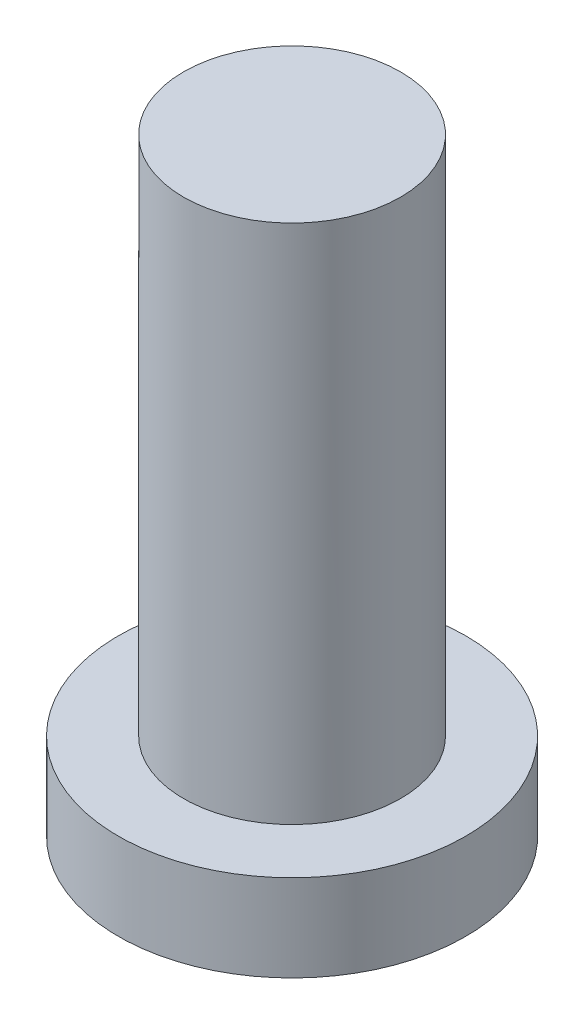
ISO-10303-21;
HEADER;
FILE_DESCRIPTION(('STEP AP214'),'2;1');
FILE_NAME('part.step','',(''),(''),'','','');
FILE_SCHEMA(('AUTOMOTIVE_DESIGN { 1 0 10303 214 1 1 1 1 }'));
ENDSEC;
DATA;
#1=APPLICATION_CONTEXT('core data for automotive mechanical design processes');
#2=APPLICATION_PROTOCOL_DEFINITION('international standard','automotive_design',2000,#1);
#3=PRODUCT_CONTEXT('',#1,'mechanical');
#4=PRODUCT('Part','Part','',(#3));
#5=PRODUCT_RELATED_PRODUCT_CATEGORY('part','',(#4));
#6=PRODUCT_DEFINITION_FORMATION('','',#4);
#7=PRODUCT_DEFINITION_CONTEXT('part definition',#1,'design');
#8=PRODUCT_DEFINITION('design','',#6,#7);
#9=PRODUCT_DEFINITION_SHAPE('','',#8);
#10=(LENGTH_UNIT() NAMED_UNIT(*) SI_UNIT(.MILLI.,.METRE.));
#11=(NAMED_UNIT(*) PLANE_ANGLE_UNIT() SI_UNIT($,.RADIAN.));
#12=(NAMED_UNIT(*) SI_UNIT($,.STERADIAN.) SOLID_ANGLE_UNIT());
#13=UNCERTAINTY_MEASURE_WITH_UNIT(LENGTH_MEASURE(1.E-05),#10,'distance_accuracy_value','');
#14=(GEOMETRIC_REPRESENTATION_CONTEXT(3) GLOBAL_UNCERTAINTY_ASSIGNED_CONTEXT((#13)) GLOBAL_UNIT_ASSIGNED_CONTEXT((#10,
#11,#12)) REPRESENTATION_CONTEXT('',''));
#15=CARTESIAN_POINT('',(0.,0.,0.));
#16=DIRECTION('',(0.,0.,1.));
#17=DIRECTION('',(1.,0.,0.));
#18=AXIS2_PLACEMENT_3D('',#15,#16,#17);
#19=CARTESIAN_POINT('',(0.,6.,0.));
#20=DIRECTION('',(0.,-1.,0.));
#21=DIRECTION('',(0.,0.,-1.));
#22=AXIS2_PLACEMENT_3D('',#19,#20,#21);
#23=CYLINDRICAL_SURFACE('',#22,1.25);
#24=CARTESIAN_POINT('',(0.,6.,0.));
#25=DIRECTION('',(0.,1.,0.));
#26=DIRECTION('',(0.,0.,1.));
#27=AXIS2_PLACEMENT_3D('',#24,#25,#26);
#28=CIRCLE('',#27,1.25);
#29=CARTESIAN_POINT('',(0.,6.,1.25));
#30=VERTEX_POINT('',#29);
#31=EDGE_CURVE('E10',#30,#30,#28,.T.);
#32=ORIENTED_EDGE('',*,*,#31,.F.);
#33=EDGE_LOOP('',(#32));
#34=FACE_BOUND('',#33,.T.);
#35=CARTESIAN_POINT('',(0.,0.,0.));
#36=DIRECTION('',(0.,-1.,0.));
#37=DIRECTION('',(0.,0.,-1.));
#38=AXIS2_PLACEMENT_3D('',#35,#36,#37);
#39=CIRCLE('',#38,1.25);
#40=CARTESIAN_POINT('',(0.,0.,-1.25));
#41=VERTEX_POINT('',#40);
#42=EDGE_CURVE('E37',#41,#41,#39,.T.);
#43=ORIENTED_EDGE('',*,*,#42,.F.);
#44=EDGE_LOOP('',(#43));
#45=FACE_BOUND('',#44,.T.);
#46=ADVANCED_FACE('F31',(#34,#45),#23,.T.);
#47=CARTESIAN_POINT('',(0.,6.,0.));
#48=DIRECTION('',(0.,1.,0.));
#49=DIRECTION('',(0.,0.,1.));
#50=AXIS2_PLACEMENT_3D('',#47,#48,#49);
#51=PLANE('',#50);
#52=ORIENTED_EDGE('',*,*,#31,.T.);
#53=EDGE_LOOP('',(#52));
#54=FACE_BOUND('',#53,.T.);
#55=ADVANCED_FACE('F64',(#54),#51,.T.);
#56=CARTESIAN_POINT('',(0.,-1.,0.));
#57=DIRECTION('',(0.,1.,0.));
#58=DIRECTION('',(0.,0.,1.));
#59=AXIS2_PLACEMENT_3D('',#56,#57,#58);
#60=CYLINDRICAL_SURFACE('',#59,2.);
#61=CARTESIAN_POINT('',(0.,-1.,0.));
#62=DIRECTION('',(0.,-1.,0.));
#63=DIRECTION('',(0.,0.,-1.));
#64=AXIS2_PLACEMENT_3D('',#61,#62,#63);
#65=CIRCLE('',#64,2.);
#66=CARTESIAN_POINT('',(0.,-1.,-2.));
#67=VERTEX_POINT('',#66);
#68=EDGE_CURVE('E41',#67,#67,#65,.T.);
#69=ORIENTED_EDGE('',*,*,#68,.F.);
#70=EDGE_LOOP('',(#69));
#71=FACE_BOUND('',#70,.T.);
#72=CARTESIAN_POINT('',(0.,0.,0.));
#73=DIRECTION('',(0.,-1.,0.));
#74=DIRECTION('',(0.,0.,-1.));
#75=AXIS2_PLACEMENT_3D('',#72,#73,#74);
#76=CIRCLE('',#75,2.);
#77=CARTESIAN_POINT('',(0.,0.,-2.));
#78=VERTEX_POINT('',#77);
#79=EDGE_CURVE('E45',#78,#78,#76,.T.);
#80=ORIENTED_EDGE('',*,*,#79,.T.);
#81=EDGE_LOOP('',(#80));
#82=FACE_BOUND('',#81,.T.);
#83=ADVANCED_FACE('F51',(#71,#82),#60,.T.);
#84=CARTESIAN_POINT('',(0.,-1.,0.));
#85=DIRECTION('',(0.,-1.,0.));
#86=DIRECTION('',(0.,0.,-1.));
#87=AXIS2_PLACEMENT_3D('',#84,#85,#86);
#88=PLANE('',#87);
#89=ORIENTED_EDGE('',*,*,#68,.T.);
#90=EDGE_LOOP('',(#89));
#91=FACE_BOUND('',#90,.T.);
#92=ADVANCED_FACE('F55',(#91),#88,.T.);
#93=CARTESIAN_POINT('',(0.,0.,0.));
#94=DIRECTION('',(0.,-1.,0.));
#95=DIRECTION('',(0.,0.,-1.));
#96=AXIS2_PLACEMENT_3D('',#93,#94,#95);
#97=PLANE('',#96);
#98=ORIENTED_EDGE('',*,*,#42,.T.);
#99=EDGE_LOOP('',(#98));
#100=FACE_BOUND('',#99,.T.);
#101=ORIENTED_EDGE('',*,*,#79,.F.);
#102=EDGE_LOOP('',(#101));
#103=FACE_BOUND('',#102,.T.);
#104=ADVANCED_FACE('F53',(#100,#103),#97,.F.);
#105=CLOSED_SHELL('',(#46,#55,#83,#92,#104));
#106=MANIFOLD_SOLID_BREP('B2',#105);
#107=ADVANCED_BREP_SHAPE_REPRESENTATION('',(#18,#106),#14);
#108=SHAPE_DEFINITION_REPRESENTATION(#9,#107);
ENDSEC;
END-ISO-10303-21;
